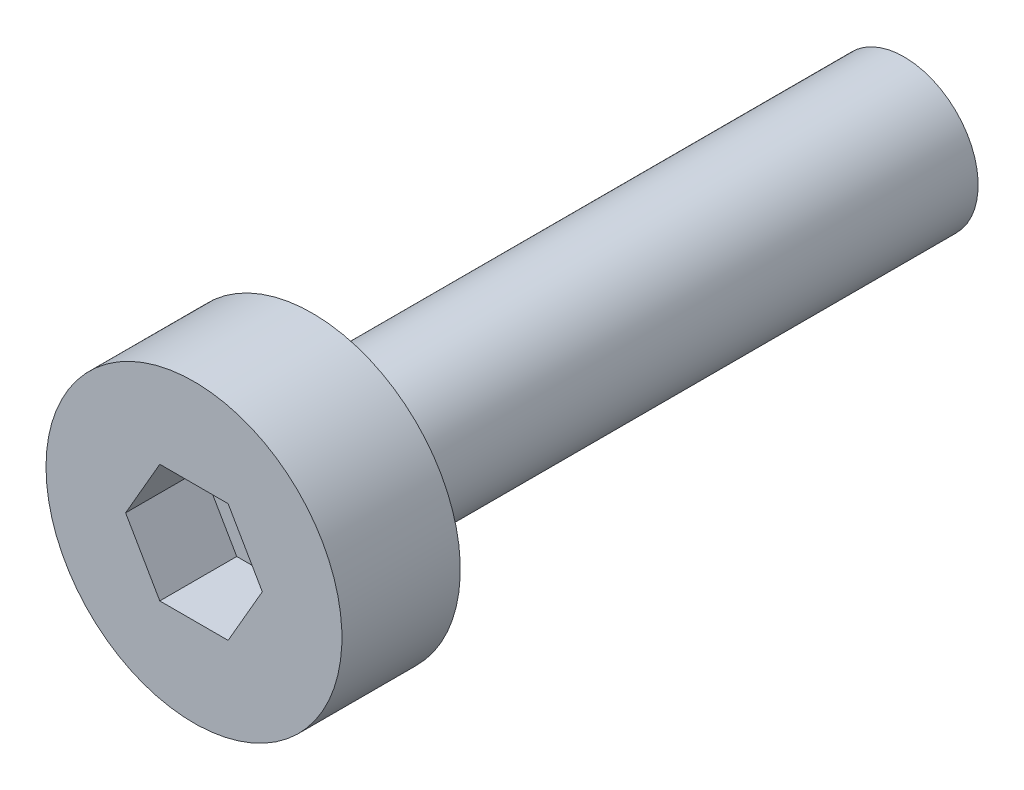
ISO-10303-21;
HEADER;
FILE_DESCRIPTION(('STEP AP214'),'2;1');
FILE_NAME('part.step','',(''),(''),'','','');
FILE_SCHEMA(('AUTOMOTIVE_DESIGN { 1 0 10303 214 1 1 1 1 }'));
ENDSEC;
DATA;
#1=APPLICATION_CONTEXT('core data for automotive mechanical design processes');
#2=APPLICATION_PROTOCOL_DEFINITION('international standard','automotive_design',2000,#1);
#3=PRODUCT_CONTEXT('',#1,'mechanical');
#4=PRODUCT('Part','Part','',(#3));
#5=PRODUCT_RELATED_PRODUCT_CATEGORY('part','',(#4));
#6=PRODUCT_DEFINITION_FORMATION('','',#4);
#7=PRODUCT_DEFINITION_CONTEXT('part definition',#1,'design');
#8=PRODUCT_DEFINITION('design','',#6,#7);
#9=PRODUCT_DEFINITION_SHAPE('','',#8);
#10=(LENGTH_UNIT() NAMED_UNIT(*) SI_UNIT(.MILLI.,.METRE.));
#11=(NAMED_UNIT(*) PLANE_ANGLE_UNIT() SI_UNIT($,.RADIAN.));
#12=(NAMED_UNIT(*) SI_UNIT($,.STERADIAN.) SOLID_ANGLE_UNIT());
#13=UNCERTAINTY_MEASURE_WITH_UNIT(LENGTH_MEASURE(1.E-05),#10,'distance_accuracy_value','');
#14=(GEOMETRIC_REPRESENTATION_CONTEXT(3) GLOBAL_UNCERTAINTY_ASSIGNED_CONTEXT((#13)) GLOBAL_UNIT_ASSIGNED_CONTEXT((#10,
#11,#12)) REPRESENTATION_CONTEXT('',''));
#15=CARTESIAN_POINT('',(0.,0.,0.));
#16=DIRECTION('',(0.,0.,1.));
#17=DIRECTION('',(1.,0.,0.));
#18=AXIS2_PLACEMENT_3D('',#15,#16,#17);
#19=CARTESIAN_POINT('',(0.,0.,0.7));
#20=DIRECTION('',(0.,0.,1.));
#21=DIRECTION('',(1.,0.,0.));
#22=AXIS2_PLACEMENT_3D('',#19,#20,#21);
#23=PLANE('',#22);
#24=DIRECTION('',(-0.50000000000019,0.866025403784329,0.));
#25=VECTOR('',#24,1.);
#26=CARTESIAN_POINT('',(1.154700538379,0.,0.7));
#27=LINE('',#26,#25);
#28=CARTESIAN_POINT('',(1.154700538379,0.,0.7));
#29=VERTEX_POINT('',#28);
#30=CARTESIAN_POINT('',(0.57735026919,1.,0.7));
#31=VERTEX_POINT('',#30);
#32=EDGE_CURVE('E10',#29,#31,#27,.T.);
#33=ORIENTED_EDGE('',*,*,#32,.T.);
#34=DIRECTION('',(-1.,0.,0.));
#35=VECTOR('',#34,1.);
#36=CARTESIAN_POINT('',(0.57735026919,1.,0.7));
#37=LINE('',#36,#35);
#38=CARTESIAN_POINT('',(-0.57735026919,1.,0.7));
#39=VERTEX_POINT('',#38);
#40=EDGE_CURVE('E122',#31,#39,#37,.T.);
#41=ORIENTED_EDGE('',*,*,#40,.T.);
#42=DIRECTION('',(-0.50000000000019,-0.866025403784329,0.));
#43=VECTOR('',#42,1.);
#44=CARTESIAN_POINT('',(-0.57735026919,1.,0.7));
#45=LINE('',#44,#43);
#46=CARTESIAN_POINT('',(-1.154700538379,0.,0.7));
#47=VERTEX_POINT('',#46);
#48=EDGE_CURVE('E19',#39,#47,#45,.T.);
#49=ORIENTED_EDGE('',*,*,#48,.T.);
#50=DIRECTION('',(0.50000000000019,-0.866025403784329,0.));
#51=VECTOR('',#50,1.);
#52=CARTESIAN_POINT('',(-1.154700538379,0.,0.7));
#53=LINE('',#52,#51);
#54=CARTESIAN_POINT('',(-0.57735026919,-1.,0.7));
#55=VERTEX_POINT('',#54);
#56=EDGE_CURVE('E148',#47,#55,#53,.T.);
#57=ORIENTED_EDGE('',*,*,#56,.T.);
#58=DIRECTION('',(1.,0.,0.));
#59=VECTOR('',#58,1.);
#60=CARTESIAN_POINT('',(-0.57735026919,-1.,0.7));
#61=LINE('',#60,#59);
#62=CARTESIAN_POINT('',(0.57735026919,-1.,0.7));
#63=VERTEX_POINT('',#62);
#64=EDGE_CURVE('E121',#55,#63,#61,.T.);
#65=ORIENTED_EDGE('',*,*,#64,.T.);
#66=DIRECTION('',(0.50000000000019,0.866025403784329,0.));
#67=VECTOR('',#66,1.);
#68=CARTESIAN_POINT('',(0.57735026919,-1.,0.7));
#69=LINE('',#68,#67);
#70=EDGE_CURVE('E88',#63,#29,#69,.T.);
#71=ORIENTED_EDGE('',*,*,#70,.T.);
#72=EDGE_LOOP('',(#33,#41,#49,#57,#65,#71));
#73=FACE_BOUND('',#72,.T.);
#74=ADVANCED_FACE('F15',(#73),#23,.T.);
#75=CARTESIAN_POINT('',(0.,0.,-10.));
#76=DIRECTION('',(0.,0.,-1.));
#77=DIRECTION('',(0.,-1.,0.));
#78=AXIS2_PLACEMENT_3D('',#75,#76,#77);
#79=PLANE('',#78);
#80=CARTESIAN_POINT('',(0.,0.,-10.));
#81=DIRECTION('',(0.,0.,-1.));
#82=DIRECTION('',(-1.,0.,0.));
#83=AXIS2_PLACEMENT_3D('',#80,#81,#82);
#84=CIRCLE('',#83,1.25);
#85=CARTESIAN_POINT('',(-1.25,0.,-10.));
#86=VERTEX_POINT('',#85);
#87=EDGE_CURVE('E84',#86,#86,#84,.T.);
#88=ORIENTED_EDGE('',*,*,#87,.T.);
#89=EDGE_LOOP('',(#88));
#90=FACE_BOUND('',#89,.T.);
#91=ADVANCED_FACE('F91',(#90),#79,.T.);
#92=CARTESIAN_POINT('',(1.154700538379,0.,0.7));
#93=DIRECTION('',(-0.866025403784329,-0.50000000000019,0.));
#94=DIRECTION('',(-0.50000000000019,0.866025403784329,0.));
#95=AXIS2_PLACEMENT_3D('',#92,#93,#94);
#96=PLANE('',#95);
#97=ORIENTED_EDGE('',*,*,#32,.F.);
#98=DIRECTION('',(0.,0.,1.));
#99=VECTOR('',#98,1.);
#100=CARTESIAN_POINT('',(1.154700538379,0.,0.7));
#101=LINE('',#100,#99);
#102=CARTESIAN_POINT('',(1.154700538379,0.,2.));
#103=VERTEX_POINT('',#102);
#104=EDGE_CURVE('E118',#29,#103,#101,.T.);
#105=ORIENTED_EDGE('',*,*,#104,.T.);
#106=DIRECTION('',(-0.50000000000019,0.866025403784329,0.));
#107=VECTOR('',#106,1.);
#108=CARTESIAN_POINT('',(1.010362971082,0.25,2.));
#109=LINE('',#108,#107);
#110=CARTESIAN_POINT('',(0.57735026919,1.,2.));
#111=VERTEX_POINT('',#110);
#112=EDGE_CURVE('E99',#103,#111,#109,.T.);
#113=ORIENTED_EDGE('',*,*,#112,.T.);
#114=DIRECTION('',(0.,0.,1.));
#115=VECTOR('',#114,1.);
#116=CARTESIAN_POINT('',(0.57735026919,1.,0.7));
#117=LINE('',#116,#115);
#118=EDGE_CURVE('E26',#31,#111,#117,.T.);
#119=ORIENTED_EDGE('',*,*,#118,.F.);
#120=EDGE_LOOP('',(#97,#105,#113,#119));
#121=FACE_BOUND('',#120,.T.);
#122=ADVANCED_FACE('F184',(#121),#96,.T.);
#123=CARTESIAN_POINT('',(0.57735026919,1.,0.7));
#124=DIRECTION('',(0.,-1.,0.));
#125=DIRECTION('',(-1.,0.,0.));
#126=AXIS2_PLACEMENT_3D('',#123,#124,#125);
#127=PLANE('',#126);
#128=ORIENTED_EDGE('',*,*,#40,.F.);
#129=ORIENTED_EDGE('',*,*,#118,.T.);
#130=DIRECTION('',(-1.,0.,0.));
#131=VECTOR('',#130,1.);
#132=CARTESIAN_POINT('',(0.288675134595,1.,2.));
#133=LINE('',#132,#131);
#134=CARTESIAN_POINT('',(-0.57735026919,1.,2.));
#135=VERTEX_POINT('',#134);
#136=EDGE_CURVE('E109',#111,#135,#133,.T.);
#137=ORIENTED_EDGE('',*,*,#136,.T.);
#138=DIRECTION('',(0.,0.,1.));
#139=VECTOR('',#138,1.);
#140=CARTESIAN_POINT('',(-0.57735026919,1.,0.7));
#141=LINE('',#140,#139);
#142=EDGE_CURVE('E125',#39,#135,#141,.T.);
#143=ORIENTED_EDGE('',*,*,#142,.F.);
#144=EDGE_LOOP('',(#128,#129,#137,#143));
#145=FACE_BOUND('',#144,.T.);
#146=ADVANCED_FACE('F190',(#145),#127,.T.);
#147=CARTESIAN_POINT('',(-0.57735026919,1.,0.7));
#148=DIRECTION('',(0.866025403784329,-0.50000000000019,0.));
#149=DIRECTION('',(0.,0.,-1.));
#150=AXIS2_PLACEMENT_3D('',#147,#148,#149);
#151=PLANE('',#150);
#152=ORIENTED_EDGE('',*,*,#48,.F.);
#153=ORIENTED_EDGE('',*,*,#142,.T.);
#154=DIRECTION('',(-0.50000000000019,-0.866025403784329,0.));
#155=VECTOR('',#154,1.);
#156=CARTESIAN_POINT('',(-0.721687836487,0.75,2.));
#157=LINE('',#156,#155);
#158=CARTESIAN_POINT('',(-1.154700538379,0.,2.));
#159=VERTEX_POINT('',#158);
#160=EDGE_CURVE('E117',#135,#159,#157,.T.);
#161=ORIENTED_EDGE('',*,*,#160,.T.);
#162=DIRECTION('',(0.,0.,1.));
#163=VECTOR('',#162,1.);
#164=CARTESIAN_POINT('',(-1.154700538379,0.,0.7));
#165=LINE('',#164,#163);
#166=EDGE_CURVE('E151',#47,#159,#165,.T.);
#167=ORIENTED_EDGE('',*,*,#166,.F.);
#168=EDGE_LOOP('',(#152,#153,#161,#167));
#169=FACE_BOUND('',#168,.T.);
#170=ADVANCED_FACE('F195',(#169),#151,.T.);
#171=CARTESIAN_POINT('',(-1.154700538379,0.,0.7));
#172=DIRECTION('',(0.866025403784329,0.50000000000019,0.));
#173=DIRECTION('',(0.,0.,-1.));
#174=AXIS2_PLACEMENT_3D('',#171,#172,#173);
#175=PLANE('',#174);
#176=ORIENTED_EDGE('',*,*,#56,.F.);
#177=ORIENTED_EDGE('',*,*,#166,.T.);
#178=DIRECTION('',(0.50000000000019,-0.866025403784329,0.));
#179=VECTOR('',#178,1.);
#180=CARTESIAN_POINT('',(-1.010362971082,-0.25,2.));
#181=LINE('',#180,#179);
#182=CARTESIAN_POINT('',(-0.57735026919,-1.,2.));
#183=VERTEX_POINT('',#182);
#184=EDGE_CURVE('E106',#159,#183,#181,.T.);
#185=ORIENTED_EDGE('',*,*,#184,.T.);
#186=DIRECTION('',(0.,0.,1.));
#187=VECTOR('',#186,1.);
#188=CARTESIAN_POINT('',(-0.57735026919,-1.,0.7));
#189=LINE('',#188,#187);
#190=EDGE_CURVE('E131',#55,#183,#189,.T.);
#191=ORIENTED_EDGE('',*,*,#190,.F.);
#192=EDGE_LOOP('',(#176,#177,#185,#191));
#193=FACE_BOUND('',#192,.T.);
#194=ADVANCED_FACE('F17',(#193),#175,.T.);
#195=CARTESIAN_POINT('',(-0.57735026919,-1.,0.7));
#196=DIRECTION('',(0.,1.,0.));
#197=DIRECTION('',(1.,0.,0.));
#198=AXIS2_PLACEMENT_3D('',#195,#196,#197);
#199=PLANE('',#198);
#200=ORIENTED_EDGE('',*,*,#64,.F.);
#201=ORIENTED_EDGE('',*,*,#190,.T.);
#202=DIRECTION('',(1.,0.,0.));
#203=VECTOR('',#202,1.);
#204=CARTESIAN_POINT('',(-0.288675134595,-1.,2.));
#205=LINE('',#204,#203);
#206=CARTESIAN_POINT('',(0.57735026919,-1.,2.));
#207=VERTEX_POINT('',#206);
#208=EDGE_CURVE('E103',#183,#207,#205,.T.);
#209=ORIENTED_EDGE('',*,*,#208,.T.);
#210=DIRECTION('',(0.,0.,1.));
#211=VECTOR('',#210,1.);
#212=CARTESIAN_POINT('',(0.57735026919,-1.,0.7));
#213=LINE('',#212,#211);
#214=EDGE_CURVE('E113',#63,#207,#213,.T.);
#215=ORIENTED_EDGE('',*,*,#214,.F.);
#216=EDGE_LOOP('',(#200,#201,#209,#215));
#217=FACE_BOUND('',#216,.T.);
#218=ADVANCED_FACE('F175',(#217),#199,.T.);
#219=CARTESIAN_POINT('',(0.57735026919,-1.,0.7));
#220=DIRECTION('',(-0.866025403784329,0.50000000000019,0.));
#221=DIRECTION('',(0.,0.,1.));
#222=AXIS2_PLACEMENT_3D('',#219,#220,#221);
#223=PLANE('',#222);
#224=ORIENTED_EDGE('',*,*,#70,.F.);
#225=ORIENTED_EDGE('',*,*,#214,.T.);
#226=DIRECTION('',(0.50000000000019,0.866025403784329,0.));
#227=VECTOR('',#226,1.);
#228=CARTESIAN_POINT('',(0.721687836487,-0.75,2.));
#229=LINE('',#228,#227);
#230=EDGE_CURVE('E93',#207,#103,#229,.T.);
#231=ORIENTED_EDGE('',*,*,#230,.T.);
#232=ORIENTED_EDGE('',*,*,#104,.F.);
#233=EDGE_LOOP('',(#224,#225,#231,#232));
#234=FACE_BOUND('',#233,.T.);
#235=ADVANCED_FACE('F180',(#234),#223,.T.);
#236=CARTESIAN_POINT('',(0.,0.,0.));
#237=DIRECTION('',(0.,0.,-1.));
#238=DIRECTION('',(-1.,0.,0.));
#239=AXIS2_PLACEMENT_3D('',#236,#237,#238);
#240=CYLINDRICAL_SURFACE('',#239,1.25);
#241=ORIENTED_EDGE('',*,*,#87,.F.);
#242=DIRECTION('',(0.,0.,-1.));
#243=VECTOR('',#242,1.);
#244=CARTESIAN_POINT('',(-1.25,0.,0.));
#245=LINE('',#244,#243);
#246=CARTESIAN_POINT('',(-1.25,0.,0.));
#247=VERTEX_POINT('',#246);
#248=EDGE_CURVE('E81',#247,#86,#245,.T.);
#249=ORIENTED_EDGE('',*,*,#248,.F.);
#250=CARTESIAN_POINT('',(0.,0.,0.));
#251=DIRECTION('',(0.,0.,-1.));
#252=DIRECTION('',(-1.,0.,0.));
#253=AXIS2_PLACEMENT_3D('',#250,#251,#252);
#254=CIRCLE('',#253,1.25);
#255=EDGE_CURVE('E86',#247,#247,#254,.T.);
#256=ORIENTED_EDGE('',*,*,#255,.T.);
#257=ORIENTED_EDGE('',*,*,#248,.T.);
#258=EDGE_LOOP('',(#241,#249,#256,#257));
#259=FACE_BOUND('',#258,.T.);
#260=ADVANCED_FACE('F83',(#259),#240,.T.);
#261=CARTESIAN_POINT('',(0.,0.,2.));
#262=DIRECTION('',(0.,0.,-1.));
#263=DIRECTION('',(0.,-1.,0.));
#264=AXIS2_PLACEMENT_3D('',#261,#262,#263);
#265=PLANE('',#264);
#266=ORIENTED_EDGE('',*,*,#208,.F.);
#267=ORIENTED_EDGE('',*,*,#184,.F.);
#268=ORIENTED_EDGE('',*,*,#160,.F.);
#269=ORIENTED_EDGE('',*,*,#136,.F.);
#270=ORIENTED_EDGE('',*,*,#112,.F.);
#271=ORIENTED_EDGE('',*,*,#230,.F.);
#272=EDGE_LOOP('',(#266,#267,#268,#269,#270,#271));
#273=FACE_BOUND('',#272,.T.);
#274=CARTESIAN_POINT('',(0.,0.,2.));
#275=DIRECTION('',(0.,0.,-1.));
#276=DIRECTION('',(-1.,0.,0.));
#277=AXIS2_PLACEMENT_3D('',#274,#275,#276);
#278=CIRCLE('',#277,2.5);
#279=CARTESIAN_POINT('',(-2.5,0.,2.));
#280=VERTEX_POINT('',#279);
#281=EDGE_CURVE('E142',#280,#280,#278,.T.);
#282=ORIENTED_EDGE('',*,*,#281,.F.);
#283=EDGE_LOOP('',(#282));
#284=FACE_BOUND('',#283,.T.);
#285=ADVANCED_FACE('F220',(#273,#284),#265,.F.);
#286=CARTESIAN_POINT('',(0.,0.,0.));
#287=DIRECTION('',(0.,0.,-1.));
#288=DIRECTION('',(0.,-1.,0.));
#289=AXIS2_PLACEMENT_3D('',#286,#287,#288);
#290=PLANE('',#289);
#291=ORIENTED_EDGE('',*,*,#255,.F.);
#292=EDGE_LOOP('',(#291));
#293=FACE_BOUND('',#292,.T.);
#294=CARTESIAN_POINT('',(0.,0.,0.));
#295=DIRECTION('',(0.,0.,-1.));
#296=DIRECTION('',(-1.,0.,0.));
#297=AXIS2_PLACEMENT_3D('',#294,#295,#296);
#298=CIRCLE('',#297,2.5);
#299=CARTESIAN_POINT('',(-2.5,0.,0.));
#300=VERTEX_POINT('',#299);
#301=EDGE_CURVE('E132',#300,#300,#298,.T.);
#302=ORIENTED_EDGE('',*,*,#301,.T.);
#303=EDGE_LOOP('',(#302));
#304=FACE_BOUND('',#303,.T.);
#305=ADVANCED_FACE('F214',(#293,#304),#290,.T.);
#306=CARTESIAN_POINT('',(0.,0.,2.));
#307=DIRECTION('',(0.,0.,-1.));
#308=DIRECTION('',(-1.,0.,0.));
#309=AXIS2_PLACEMENT_3D('',#306,#307,#308);
#310=CYLINDRICAL_SURFACE('',#309,2.5);
#311=ORIENTED_EDGE('',*,*,#301,.F.);
#312=DIRECTION('',(0.,0.,-1.));
#313=VECTOR('',#312,1.);
#314=CARTESIAN_POINT('',(-2.5,0.,2.));
#315=LINE('',#314,#313);
#316=EDGE_CURVE('E135',#280,#300,#315,.T.);
#317=ORIENTED_EDGE('',*,*,#316,.F.);
#318=ORIENTED_EDGE('',*,*,#281,.T.);
#319=ORIENTED_EDGE('',*,*,#316,.T.);
#320=EDGE_LOOP('',(#311,#317,#318,#319));
#321=FACE_BOUND('',#320,.T.);
#322=ADVANCED_FACE('F219',(#321),#310,.T.);
#323=CLOSED_SHELL('',(#74,#91,#122,#146,#170,#194,#218,#235,#260,#285,#305,#322));
#324=MANIFOLD_SOLID_BREP('B1',#323);
#325=ADVANCED_BREP_SHAPE_REPRESENTATION('',(#18,#324),#14);
#326=SHAPE_DEFINITION_REPRESENTATION(#9,#325);
ENDSEC;
END-ISO-10303-21;
